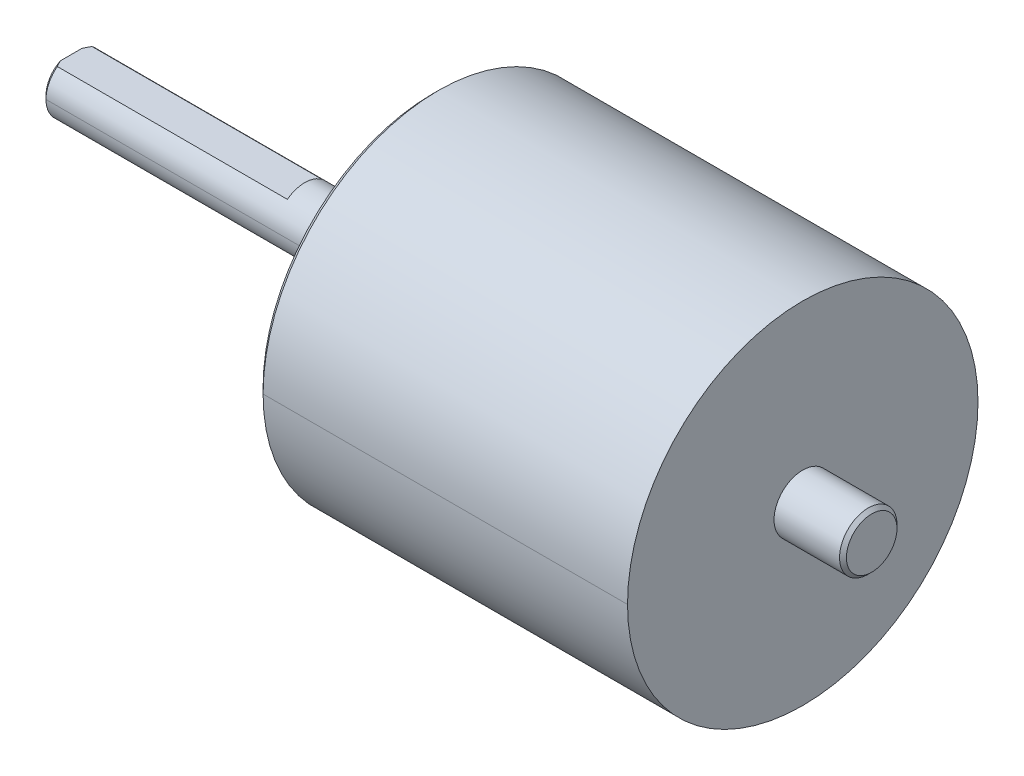
ISO-10303-21;
HEADER;
FILE_DESCRIPTION(('STEP AP214'),'2;1');
FILE_NAME('part.step','',(''),(''),'','','');
FILE_SCHEMA(('AUTOMOTIVE_DESIGN { 1 0 10303 214 1 1 1 1 }'));
ENDSEC;
DATA;
#1=APPLICATION_CONTEXT('core data for automotive mechanical design processes');
#2=APPLICATION_PROTOCOL_DEFINITION('international standard','automotive_design',2000,#1);
#3=PRODUCT_CONTEXT('',#1,'mechanical');
#4=PRODUCT('Part','Part','',(#3));
#5=PRODUCT_RELATED_PRODUCT_CATEGORY('part','',(#4));
#6=PRODUCT_DEFINITION_FORMATION('','',#4);
#7=PRODUCT_DEFINITION_CONTEXT('part definition',#1,'design');
#8=PRODUCT_DEFINITION('design','',#6,#7);
#9=PRODUCT_DEFINITION_SHAPE('','',#8);
#10=(LENGTH_UNIT() NAMED_UNIT(*) SI_UNIT(.MILLI.,.METRE.));
#11=(NAMED_UNIT(*) PLANE_ANGLE_UNIT() SI_UNIT($,.RADIAN.));
#12=(NAMED_UNIT(*) SI_UNIT($,.STERADIAN.) SOLID_ANGLE_UNIT());
#13=UNCERTAINTY_MEASURE_WITH_UNIT(LENGTH_MEASURE(1.E-05),#10,'distance_accuracy_value','');
#14=(GEOMETRIC_REPRESENTATION_CONTEXT(3) GLOBAL_UNCERTAINTY_ASSIGNED_CONTEXT((#13)) GLOBAL_UNIT_ASSIGNED_CONTEXT((#10,
#11,#12)) REPRESENTATION_CONTEXT('',''));
#15=CARTESIAN_POINT('',(0.,0.,0.));
#16=DIRECTION('',(0.,0.,1.));
#17=DIRECTION('',(1.,0.,0.));
#18=AXIS2_PLACEMENT_3D('',#15,#16,#17);
#19=CARTESIAN_POINT('',(-11.1252,1.98755,2.49555));
#20=DIRECTION('',(0.,1.,0.));
#21=DIRECTION('',(0.,0.,1.));
#22=AXIS2_PLACEMENT_3D('',#19,#20,#21);
#23=PLANE('',#22);
#24=CARTESIAN_POINT('',(-31.4452,1.98755,0.932783361772756));
#25=CARTESIAN_POINT('',(-31.3600033930898,1.98755,1.13331589479993));
#26=CARTESIAN_POINT('',(-31.2572320918835,1.98755,1.32384804296652));
#27=CARTESIAN_POINT('',(-31.1451999999999,1.98755,1.50911059899532));
#28=B_SPLINE_CURVE_WITH_KNOTS('',3,(#24,#25,#26,#27),.UNSPECIFIED.,.F.,.F.,(4,4),
(0.00727967764469756,0.0079358726159729),.UNSPECIFIED.);
#29=CARTESIAN_POINT('',(-31.4452,1.98755,0.932783361772695));
#30=VERTEX_POINT('',#29);
#31=CARTESIAN_POINT('',(-31.1451999999999,1.98755,1.50911059899532));
#32=VERTEX_POINT('',#31);
#33=EDGE_CURVE('E119',#30,#32,#28,.T.);
#34=ORIENTED_EDGE('',*,*,#33,.T.);
#35=DIRECTION('',(1.,0.,0.));
#36=VECTOR('',#35,1.);
#37=CARTESIAN_POINT('',(44.13504,1.98755,1.50911059899532));
#38=LINE('',#37,#36);
#39=CARTESIAN_POINT('',(-11.1252,1.98755,1.50911059899532));
#40=VERTEX_POINT('',#39);
#41=EDGE_CURVE('E123',#32,#40,#38,.T.);
#42=ORIENTED_EDGE('',*,*,#41,.T.);
#43=DIRECTION('',(0.,0.,-1.));
#44=VECTOR('',#43,1.);
#45=CARTESIAN_POINT('',(-11.1252,1.98755,2.49555));
#46=LINE('',#45,#44);
#47=CARTESIAN_POINT('',(-11.1252,1.98755,-1.50911059899532));
#48=VERTEX_POINT('',#47);
#49=EDGE_CURVE('E146',#40,#48,#46,.T.);
#50=ORIENTED_EDGE('',*,*,#49,.T.);
#51=DIRECTION('',(1.,0.,0.));
#52=VECTOR('',#51,1.);
#53=CARTESIAN_POINT('',(44.13504,1.98755,-1.50911059899532));
#54=LINE('',#53,#52);
#55=CARTESIAN_POINT('',(-31.1451999999999,1.98755,-1.50911059899532));
#56=VERTEX_POINT('',#55);
#57=EDGE_CURVE('E157',#56,#48,#54,.T.);
#58=ORIENTED_EDGE('',*,*,#57,.F.);
#59=CARTESIAN_POINT('',(-31.1451999999999,1.98755,-1.50911059899532));
#60=CARTESIAN_POINT('',(-31.2576842597599,1.98755,-1.32310031278401));
#61=CARTESIAN_POINT('',(-31.3604226766004,1.98755,-1.13232900121902));
#62=CARTESIAN_POINT('',(-31.4452,1.98755,-0.932783361772695));
#63=B_SPLINE_CURVE_WITH_KNOTS('',3,(#59,#60,#61,#62),.UNSPECIFIED.,.F.,.F.,(4,4),
(0.00470476113088296,0.00535512984343857),.UNSPECIFIED.);
#64=CARTESIAN_POINT('',(-31.4452,1.98755,-0.932783361772695));
#65=VERTEX_POINT('',#64);
#66=EDGE_CURVE('E148',#56,#65,#63,.T.);
#67=ORIENTED_EDGE('',*,*,#66,.T.);
#68=DIRECTION('',(0.,0.,-1.));
#69=VECTOR('',#68,1.);
#70=CARTESIAN_POINT('',(-31.4452,1.98755,2.49555));
#71=LINE('',#70,#69);
#72=EDGE_CURVE('E126',#30,#65,#71,.T.);
#73=ORIENTED_EDGE('',*,*,#72,.F.);
#74=EDGE_LOOP('',(#34,#42,#50,#58,#67,#73));
#75=FACE_BOUND('',#74,.T.);
#76=ADVANCED_FACE('F34',(#75),#23,.T.);
#77=CARTESIAN_POINT('',(-31.4452,1.1431733546534,0.));
#78=DIRECTION('',(1.,0.,0.));
#79=DIRECTION('',(0.,0.,-1.));
#80=AXIS2_PLACEMENT_3D('',#77,#78,#79);
#81=PLANE('',#80);
#82=ORIENTED_EDGE('',*,*,#72,.T.);
#83=CARTESIAN_POINT('',(-31.4452,0.,0.));
#84=DIRECTION('',(1.,0.,0.));
#85=DIRECTION('',(0.,0.,-1.));
#86=AXIS2_PLACEMENT_3D('',#83,#84,#85);
#87=CIRCLE('',#86,2.19555);
#88=CARTESIAN_POINT('',(-31.4452,0.,-2.19555));
#89=VERTEX_POINT('',#88);
#90=EDGE_CURVE('E774',#89,#65,#87,.T.);
#91=ORIENTED_EDGE('',*,*,#90,.F.);
#92=CARTESIAN_POINT('',(-31.4452,0.,0.));
#93=DIRECTION('',(1.,0.,0.));
#94=DIRECTION('',(0.,0.,-1.));
#95=AXIS2_PLACEMENT_3D('',#92,#93,#94);
#96=CIRCLE('',#95,2.19555);
#97=EDGE_CURVE('E770',#30,#89,#96,.T.);
#98=ORIENTED_EDGE('',*,*,#97,.F.);
#99=EDGE_LOOP('',(#82,#91,#98));
#100=FACE_BOUND('',#99,.T.);
#101=CARTESIAN_POINT('',(-31.4452,0.,0.));
#102=DIRECTION('',(1.,0.,0.));
#103=DIRECTION('',(0.,0.,-1.));
#104=AXIS2_PLACEMENT_3D('',#101,#102,#103);
#105=CIRCLE('',#104,1.1431733546534);
#106=CARTESIAN_POINT('',(-31.4452,0.,-1.1431733546534));
#107=VERTEX_POINT('',#106);
#108=CARTESIAN_POINT('',(-31.4452,0.,1.14317335465341));
#109=VERTEX_POINT('',#108);
#110=EDGE_CURVE('E781',#107,#109,#105,.T.);
#111=ORIENTED_EDGE('',*,*,#110,.T.);
#112=CARTESIAN_POINT('',(-31.4452,0.,0.));
#113=DIRECTION('',(1.,0.,0.));
#114=DIRECTION('',(0.,0.,-1.));
#115=AXIS2_PLACEMENT_3D('',#112,#113,#114);
#116=CIRCLE('',#115,1.1431733546534);
#117=EDGE_CURVE('E783',#109,#107,#116,.T.);
#118=ORIENTED_EDGE('',*,*,#117,.T.);
#119=EDGE_LOOP('',(#111,#118));
#120=FACE_BOUND('',#119,.T.);
#121=ADVANCED_FACE('F177',(#100,#120),#81,.F.);
#122=CARTESIAN_POINT('',(-30.4992,0.,0.));
#123=DIRECTION('',(-1.,0.,0.));
#124=DIRECTION('',(0.,1.,0.));
#125=AXIS2_PLACEMENT_3D('',#122,#123,#124);
#126=CONICAL_SURFACE('',#125,0.597,0.523598775598315);
#127=ORIENTED_EDGE('',*,*,#117,.F.);
#128=CARTESIAN_POINT('',(-30.4992,0.,0.597));
#129=DIRECTION('',(-0.86602540378443,0.,0.500000000000015));
#130=VECTOR('',#129,1.);
#131=LINE('',#128,#130);
#132=CARTESIAN_POINT('',(-30.4992,0.,0.597));
#133=VERTEX_POINT('',#132);
#134=EDGE_CURVE('E222',#133,#109,#131,.T.);
#135=ORIENTED_EDGE('',*,*,#134,.F.);
#136=CARTESIAN_POINT('',(-30.4992,0.,0.));
#137=DIRECTION('',(1.,0.,0.));
#138=DIRECTION('',(0.,0.,-1.));
#139=AXIS2_PLACEMENT_3D('',#136,#137,#138);
#140=CIRCLE('',#139,0.597);
#141=CARTESIAN_POINT('',(-30.4992,0.,-0.597));
#142=VERTEX_POINT('',#141);
#143=EDGE_CURVE('E786',#133,#142,#140,.T.);
#144=ORIENTED_EDGE('',*,*,#143,.T.);
#145=CARTESIAN_POINT('',(-30.4992,0.,-0.597));
#146=DIRECTION('',(-0.86602540378443,0.,-0.500000000000015));
#147=VECTOR('',#146,1.);
#148=LINE('',#145,#147);
#149=EDGE_CURVE('E223',#142,#107,#148,.T.);
#150=ORIENTED_EDGE('',*,*,#149,.T.);
#151=EDGE_LOOP('',(#127,#135,#144,#150));
#152=FACE_BOUND('',#151,.T.);
#153=ADVANCED_FACE('F190',(#152),#126,.F.);
#154=CARTESIAN_POINT('',(-30.4992,0.,0.));
#155=DIRECTION('',(-1.,0.,0.));
#156=DIRECTION('',(0.,-1.,0.));
#157=AXIS2_PLACEMENT_3D('',#154,#155,#156);
#158=CONICAL_SURFACE('',#157,0.597,0.523598775598315);
#159=CARTESIAN_POINT('',(-30.4992,0.,0.));
#160=DIRECTION('',(1.,0.,0.));
#161=DIRECTION('',(0.,0.,-1.));
#162=AXIS2_PLACEMENT_3D('',#159,#160,#161);
#163=CIRCLE('',#162,0.597);
#164=EDGE_CURVE('E219',#142,#133,#163,.T.);
#165=ORIENTED_EDGE('',*,*,#164,.T.);
#166=ORIENTED_EDGE('',*,*,#134,.T.);
#167=ORIENTED_EDGE('',*,*,#110,.F.);
#168=ORIENTED_EDGE('',*,*,#149,.F.);
#169=EDGE_LOOP('',(#165,#166,#167,#168));
#170=FACE_BOUND('',#169,.T.);
#171=ADVANCED_FACE('F195',(#170),#158,.F.);
#172=CARTESIAN_POINT('',(44.13504,0.,0.));
#173=DIRECTION('',(-1.,0.,0.));
#174=DIRECTION('',(0.,-1.,0.));
#175=AXIS2_PLACEMENT_3D('',#172,#173,#174);
#176=CYLINDRICAL_SURFACE('',#175,0.597);
#177=CARTESIAN_POINT('',(-29.3051999999999,0.,0.));
#178=DIRECTION('',(1.,0.,0.));
#179=DIRECTION('',(0.,0.,-1.));
#180=AXIS2_PLACEMENT_3D('',#177,#178,#179);
#181=CIRCLE('',#180,0.597);
#182=CARTESIAN_POINT('',(-29.3051999999999,0.,-0.597));
#183=VERTEX_POINT('',#182);
#184=CARTESIAN_POINT('',(-29.3052000000038,0.,0.596999999997706));
#185=VERTEX_POINT('',#184);
#186=EDGE_CURVE('E249',#183,#185,#181,.T.);
#187=ORIENTED_EDGE('',*,*,#186,.T.);
#188=CARTESIAN_POINT('',(-29.3051999999999,0.,0.597));
#189=DIRECTION('',(-1.,0.,0.));
#190=VECTOR('',#189,1.);
#191=LINE('',#188,#190);
#192=EDGE_CURVE('E251',#185,#133,#191,.T.);
#193=ORIENTED_EDGE('',*,*,#192,.T.);
#194=ORIENTED_EDGE('',*,*,#164,.F.);
#195=CARTESIAN_POINT('',(-29.3051999999999,0.,-0.597));
#196=DIRECTION('',(-1.,0.,0.));
#197=VECTOR('',#196,1.);
#198=LINE('',#195,#197);
#199=EDGE_CURVE('E298',#183,#142,#198,.T.);
#200=ORIENTED_EDGE('',*,*,#199,.F.);
#201=EDGE_LOOP('',(#187,#193,#194,#200));
#202=FACE_BOUND('',#201,.T.);
#203=ADVANCED_FACE('F261',(#202),#176,.F.);
#204=CARTESIAN_POINT('',(44.13504,0.,0.));
#205=DIRECTION('',(-1.,0.,0.));
#206=DIRECTION('',(0.,1.,0.));
#207=AXIS2_PLACEMENT_3D('',#204,#205,#206);
#208=CYLINDRICAL_SURFACE('',#207,0.597);
#209=ORIENTED_EDGE('',*,*,#143,.F.);
#210=ORIENTED_EDGE('',*,*,#192,.F.);
#211=CARTESIAN_POINT('',(-29.3051999999999,0.,0.));
#212=DIRECTION('',(1.,0.,0.));
#213=DIRECTION('',(0.,0.,-1.));
#214=AXIS2_PLACEMENT_3D('',#211,#212,#213);
#215=CIRCLE('',#214,0.597);
#216=EDGE_CURVE('E296',#185,#183,#215,.T.);
#217=ORIENTED_EDGE('',*,*,#216,.T.);
#218=ORIENTED_EDGE('',*,*,#199,.T.);
#219=EDGE_LOOP('',(#209,#210,#217,#218));
#220=FACE_BOUND('',#219,.T.);
#221=ADVANCED_FACE('F270',(#220),#208,.F.);
#222=CARTESIAN_POINT('',(-528.96052188907,0.,0.));
#223=DIRECTION('',(-1.,0.,0.));
#224=DIRECTION('',(0.,1.,0.));
#225=AXIS2_PLACEMENT_3D('',#222,#223,#224);
#226=CONICAL_SURFACE('',#225,866.025403784567,1.04719755119686);
#227=CARTESIAN_POINT('',(-28.9605218892991,0.,1.11022302462516E-13));
#228=DIRECTION('',(-0.499999999999732,0.,-0.866025403784593));
#229=VECTOR('',#228,1.);
#230=LINE('',#227,#229);
#231=CARTESIAN_POINT('',(-28.960521889294,0.,0.));
#232=VERTEX_POINT('',#231);
#233=EDGE_CURVE('E313',#232,#183,#230,.T.);
#234=ORIENTED_EDGE('',*,*,#233,.T.);
#235=ORIENTED_EDGE('',*,*,#216,.F.);
#236=CARTESIAN_POINT('',(-28.9605218892991,0.,-1.11022302462516E-13));
#237=DIRECTION('',(-0.499999999999732,0.,0.866025403784593));
#238=VECTOR('',#237,1.);
#239=LINE('',#236,#238);
#240=EDGE_CURVE('E343',#232,#185,#239,.T.);
#241=ORIENTED_EDGE('',*,*,#240,.F.);
#242=EDGE_LOOP('',(#234,#235,#241));
#243=FACE_BOUND('',#242,.T.);
#244=ADVANCED_FACE('F319',(#243),#226,.F.);
#245=CARTESIAN_POINT('',(-528.96052188907,0.,0.));
#246=DIRECTION('',(-1.,0.,0.));
#247=DIRECTION('',(0.,-1.,0.));
#248=AXIS2_PLACEMENT_3D('',#245,#246,#247);
#249=CONICAL_SURFACE('',#248,866.025403784567,1.04719755119686);
#250=ORIENTED_EDGE('',*,*,#240,.T.);
#251=ORIENTED_EDGE('',*,*,#186,.F.);
#252=ORIENTED_EDGE('',*,*,#233,.F.);
#253=EDGE_LOOP('',(#250,#251,#252));
#254=FACE_BOUND('',#253,.T.);
#255=ADVANCED_FACE('F328',(#254),#249,.F.);
#256=CARTESIAN_POINT('',(-31.4452,0.,0.));
#257=DIRECTION('',(1.,0.,0.));
#258=DIRECTION('',(0.,0.,-1.));
#259=AXIS2_PLACEMENT_3D('',#256,#257,#258);
#260=CONICAL_SURFACE('',#259,2.19555,0.785398163397457);
#261=CARTESIAN_POINT('',(-31.1451999999999,0.,0.));
#262=DIRECTION('',(1.,0.,0.));
#263=DIRECTION('',(0.,0.,-1.));
#264=AXIS2_PLACEMENT_3D('',#261,#262,#263);
#265=CIRCLE('',#264,2.49555);
#266=CARTESIAN_POINT('',(-31.1451999999999,0.,2.49555));
#267=VERTEX_POINT('',#266);
#268=CARTESIAN_POINT('',(-31.1451999999999,0.,-2.49555));
#269=VERTEX_POINT('',#268);
#270=EDGE_CURVE('E137',#267,#269,#265,.T.);
#271=ORIENTED_EDGE('',*,*,#270,.F.);
#272=CARTESIAN_POINT('',(-31.1451999999999,0.,0.));
#273=DIRECTION('',(1.,0.,0.));
#274=DIRECTION('',(0.,0.,-1.));
#275=AXIS2_PLACEMENT_3D('',#272,#273,#274);
#276=CIRCLE('',#275,2.49555);
#277=EDGE_CURVE('E134',#32,#267,#276,.T.);
#278=ORIENTED_EDGE('',*,*,#277,.F.);
#279=ORIENTED_EDGE('',*,*,#33,.F.);
#280=ORIENTED_EDGE('',*,*,#97,.T.);
#281=DIRECTION('',(0.707106781186541,0.,-0.707106781186554));
#282=VECTOR('',#281,1.);
#283=CARTESIAN_POINT('',(-31.4452,0.,-2.19555));
#284=LINE('',#283,#282);
#285=EDGE_CURVE('E771',#89,#269,#284,.T.);
#286=ORIENTED_EDGE('',*,*,#285,.T.);
#287=EDGE_LOOP('',(#271,#278,#279,#280,#286));
#288=FACE_BOUND('',#287,.T.);
#289=ADVANCED_FACE('F135',(#288),#260,.T.);
#290=CARTESIAN_POINT('',(-31.4452,0.,0.));
#291=DIRECTION('',(1.,0.,0.));
#292=DIRECTION('',(0.,0.,-1.));
#293=AXIS2_PLACEMENT_3D('',#290,#291,#292);
#294=CONICAL_SURFACE('',#293,2.19555,0.785398163397457);
#295=ORIENTED_EDGE('',*,*,#66,.F.);
#296=CARTESIAN_POINT('',(-31.1451999999999,0.,0.));
#297=DIRECTION('',(1.,0.,0.));
#298=DIRECTION('',(0.,0.,-1.));
#299=AXIS2_PLACEMENT_3D('',#296,#297,#298);
#300=CIRCLE('',#299,2.49555);
#301=EDGE_CURVE('E159',#269,#56,#300,.T.);
#302=ORIENTED_EDGE('',*,*,#301,.F.);
#303=ORIENTED_EDGE('',*,*,#285,.F.);
#304=ORIENTED_EDGE('',*,*,#90,.T.);
#305=EDGE_LOOP('',(#295,#302,#303,#304));
#306=FACE_BOUND('',#305,.T.);
#307=ADVANCED_FACE('F380',(#306),#294,.T.);
#308=CARTESIAN_POINT('',(44.13504,0.,0.));
#309=DIRECTION('',(-1.,0.,0.));
#310=DIRECTION('',(0.,-1.,0.));
#311=AXIS2_PLACEMENT_3D('',#308,#309,#310);
#312=CYLINDRICAL_SURFACE('',#311,2.49555);
#313=CARTESIAN_POINT('',(0.,0.,0.));
#314=DIRECTION('',(1.,0.,0.));
#315=DIRECTION('',(0.,0.,-1.));
#316=AXIS2_PLACEMENT_3D('',#313,#314,#315);
#317=CIRCLE('',#316,2.49555);
#318=CARTESIAN_POINT('',(0.,0.,-2.49555));
#319=VERTEX_POINT('',#318);
#320=CARTESIAN_POINT('',(0.,0.,2.49555));
#321=VERTEX_POINT('',#320);
#322=EDGE_CURVE('E404',#319,#321,#317,.T.);
#323=ORIENTED_EDGE('',*,*,#322,.F.);
#324=CARTESIAN_POINT('',(0.,0.,-2.49555));
#325=DIRECTION('',(-1.,0.,0.));
#326=VECTOR('',#325,1.);
#327=LINE('',#324,#326);
#328=EDGE_CURVE('E401',#319,#269,#327,.T.);
#329=ORIENTED_EDGE('',*,*,#328,.T.);
#330=ORIENTED_EDGE('',*,*,#301,.T.);
#331=ORIENTED_EDGE('',*,*,#57,.T.);
#332=CARTESIAN_POINT('',(-11.1252,0.,0.));
#333=DIRECTION('',(1.,0.,0.));
#334=DIRECTION('',(0.,0.,-1.));
#335=AXIS2_PLACEMENT_3D('',#332,#333,#334);
#336=CIRCLE('',#335,2.49555);
#337=EDGE_CURVE('E140',#48,#40,#336,.T.);
#338=ORIENTED_EDGE('',*,*,#337,.T.);
#339=ORIENTED_EDGE('',*,*,#41,.F.);
#340=ORIENTED_EDGE('',*,*,#277,.T.);
#341=CARTESIAN_POINT('',(0.,0.,2.49555));
#342=DIRECTION('',(-1.,0.,0.));
#343=VECTOR('',#342,1.);
#344=LINE('',#341,#343);
#345=EDGE_CURVE('E364',#321,#267,#344,.T.);
#346=ORIENTED_EDGE('',*,*,#345,.F.);
#347=EDGE_LOOP('',(#323,#329,#330,#331,#338,#339,#340,#346));
#348=FACE_BOUND('',#347,.T.);
#349=ADVANCED_FACE('F142',(#348),#312,.T.);
#350=CARTESIAN_POINT('',(44.13504,0.,0.));
#351=DIRECTION('',(-1.,0.,0.));
#352=DIRECTION('',(0.,1.,0.));
#353=AXIS2_PLACEMENT_3D('',#350,#351,#352);
#354=CYLINDRICAL_SURFACE('',#353,2.49555);
#355=ORIENTED_EDGE('',*,*,#270,.T.);
#356=ORIENTED_EDGE('',*,*,#328,.F.);
#357=CARTESIAN_POINT('',(0.,0.,0.));
#358=DIRECTION('',(1.,0.,0.));
#359=DIRECTION('',(0.,0.,-1.));
#360=AXIS2_PLACEMENT_3D('',#357,#358,#359);
#361=CIRCLE('',#360,2.49555);
#362=EDGE_CURVE('E407',#321,#319,#361,.T.);
#363=ORIENTED_EDGE('',*,*,#362,.F.);
#364=ORIENTED_EDGE('',*,*,#345,.T.);
#365=EDGE_LOOP('',(#355,#356,#363,#364));
#366=FACE_BOUND('',#365,.T.);
#367=ADVANCED_FACE('F440',(#366),#354,.T.);
#368=CARTESIAN_POINT('',(0.,2.49555,0.));
#369=DIRECTION('',(1.,0.,0.));
#370=DIRECTION('',(0.,0.,-1.));
#371=AXIS2_PLACEMENT_3D('',#368,#369,#370);
#372=PLANE('',#371);
#373=CARTESIAN_POINT('',(0.,0.,0.));
#374=DIRECTION('',(1.,0.,0.));
#375=DIRECTION('',(0.,0.,-1.));
#376=AXIS2_PLACEMENT_3D('',#373,#374,#375);
#377=CIRCLE('',#376,14.75);
#378=CARTESIAN_POINT('',(0.,0.,-14.75));
#379=VERTEX_POINT('',#378);
#380=CARTESIAN_POINT('',(0.,0.,14.75));
#381=VERTEX_POINT('',#380);
#382=EDGE_CURVE('E464',#379,#381,#377,.T.);
#383=ORIENTED_EDGE('',*,*,#382,.F.);
#384=CARTESIAN_POINT('',(0.,0.,0.));
#385=DIRECTION('',(1.,0.,0.));
#386=DIRECTION('',(0.,0.,-1.));
#387=AXIS2_PLACEMENT_3D('',#384,#385,#386);
#388=CIRCLE('',#387,14.75);
#389=EDGE_CURVE('E471',#381,#379,#388,.T.);
#390=ORIENTED_EDGE('',*,*,#389,.F.);
#391=EDGE_LOOP('',(#383,#390));
#392=FACE_BOUND('',#391,.T.);
#393=ORIENTED_EDGE('',*,*,#322,.T.);
#394=ORIENTED_EDGE('',*,*,#362,.T.);
#395=EDGE_LOOP('',(#393,#394));
#396=FACE_BOUND('',#395,.T.);
#397=ADVANCED_FACE('F449',(#392,#396),#372,.F.);
#398=CARTESIAN_POINT('',(0.,0.,0.));
#399=DIRECTION('',(1.,0.,0.));
#400=DIRECTION('',(0.,1.,0.));
#401=AXIS2_PLACEMENT_3D('',#398,#399,#400);
#402=CONICAL_SURFACE('',#401,14.75,0.785398163397448);
#403=ORIENTED_EDGE('',*,*,#389,.T.);
#404=CARTESIAN_POINT('',(0.,0.,-14.75));
#405=DIRECTION('',(0.707106781186547,0.,-0.707106781186548));
#406=VECTOR('',#405,1.);
#407=LINE('',#404,#406);
#408=CARTESIAN_POINT('',(0.500000000000001,0.,-15.25));
#409=VERTEX_POINT('',#408);
#410=EDGE_CURVE('E468',#379,#409,#407,.T.);
#411=ORIENTED_EDGE('',*,*,#410,.T.);
#412=CARTESIAN_POINT('',(0.500000000000001,0.,0.));
#413=DIRECTION('',(1.,0.,0.));
#414=DIRECTION('',(0.,0.,-1.));
#415=AXIS2_PLACEMENT_3D('',#412,#413,#414);
#416=CIRCLE('',#415,15.25);
#417=CARTESIAN_POINT('',(0.5,0.,15.25));
#418=VERTEX_POINT('',#417);
#419=EDGE_CURVE('E579',#418,#409,#416,.T.);
#420=ORIENTED_EDGE('',*,*,#419,.F.);
#421=CARTESIAN_POINT('',(0.,0.,14.75));
#422=DIRECTION('',(0.707106781186547,0.,0.707106781186548));
#423=VECTOR('',#422,1.);
#424=LINE('',#421,#423);
#425=EDGE_CURVE('E467',#381,#418,#424,.T.);
#426=ORIENTED_EDGE('',*,*,#425,.F.);
#427=EDGE_LOOP('',(#403,#411,#420,#426));
#428=FACE_BOUND('',#427,.T.);
#429=ADVANCED_FACE('F485',(#428),#402,.T.);
#430=CARTESIAN_POINT('',(0.,0.,0.));
#431=DIRECTION('',(1.,0.,0.));
#432=DIRECTION('',(0.,-1.,0.));
#433=AXIS2_PLACEMENT_3D('',#430,#431,#432);
#434=CONICAL_SURFACE('',#433,14.75,0.785398163397448);
#435=CARTESIAN_POINT('',(0.500000000000001,0.,0.));
#436=DIRECTION('',(1.,0.,0.));
#437=DIRECTION('',(0.,0.,-1.));
#438=AXIS2_PLACEMENT_3D('',#435,#436,#437);
#439=CIRCLE('',#438,15.25);
#440=EDGE_CURVE('E511',#409,#418,#439,.T.);
#441=ORIENTED_EDGE('',*,*,#440,.F.);
#442=ORIENTED_EDGE('',*,*,#410,.F.);
#443=ORIENTED_EDGE('',*,*,#382,.T.);
#444=ORIENTED_EDGE('',*,*,#425,.T.);
#445=EDGE_LOOP('',(#441,#442,#443,#444));
#446=FACE_BOUND('',#445,.T.);
#447=ADVANCED_FACE('F494',(#446),#434,.T.);
#448=CARTESIAN_POINT('',(44.13504,0.,0.));
#449=DIRECTION('',(-1.,0.,0.));
#450=DIRECTION('',(0.,-1.,0.));
#451=AXIS2_PLACEMENT_3D('',#448,#449,#450);
#452=CYLINDRICAL_SURFACE('',#451,15.25);
#453=CARTESIAN_POINT('',(32.2148,0.,0.));
#454=DIRECTION('',(-1.,0.,0.));
#455=DIRECTION('',(0.,-1.,0.));
#456=AXIS2_PLACEMENT_3D('',#453,#454,#455);
#457=CIRCLE('',#456,15.25);
#458=CARTESIAN_POINT('',(32.2148,0.,-15.25));
#459=VERTEX_POINT('',#458);
#460=CARTESIAN_POINT('',(32.2148,0.,15.25));
#461=VERTEX_POINT('',#460);
#462=EDGE_CURVE('E51',#459,#461,#457,.F.);
#463=ORIENTED_EDGE('',*,*,#462,.F.);
#464=CARTESIAN_POINT('',(32.2148,0.,-15.25));
#465=DIRECTION('',(-1.,0.,0.));
#466=VECTOR('',#465,1.);
#467=LINE('',#464,#466);
#468=EDGE_CURVE('E515',#459,#409,#467,.T.);
#469=ORIENTED_EDGE('',*,*,#468,.T.);
#470=ORIENTED_EDGE('',*,*,#440,.T.);
#471=CARTESIAN_POINT('',(32.2148,0.,15.25));
#472=DIRECTION('',(-1.,0.,0.));
#473=VECTOR('',#472,1.);
#474=LINE('',#471,#473);
#475=EDGE_CURVE('E514',#461,#418,#474,.T.);
#476=ORIENTED_EDGE('',*,*,#475,.F.);
#477=EDGE_LOOP('',(#463,#469,#470,#476));
#478=FACE_BOUND('',#477,.T.);
#479=ADVANCED_FACE('F542',(#478),#452,.T.);
#480=CARTESIAN_POINT('',(44.13504,0.,0.));
#481=DIRECTION('',(-1.,0.,0.));
#482=DIRECTION('',(0.,1.,0.));
#483=AXIS2_PLACEMENT_3D('',#480,#481,#482);
#484=CYLINDRICAL_SURFACE('',#483,15.25);
#485=CARTESIAN_POINT('',(32.2148,0.,0.));
#486=DIRECTION('',(-1.,0.,0.));
#487=DIRECTION('',(0.,-1.,0.));
#488=AXIS2_PLACEMENT_3D('',#485,#486,#487);
#489=CIRCLE('',#488,15.25);
#490=EDGE_CURVE('E48',#461,#459,#489,.F.);
#491=ORIENTED_EDGE('',*,*,#490,.F.);
#492=ORIENTED_EDGE('',*,*,#475,.T.);
#493=ORIENTED_EDGE('',*,*,#419,.T.);
#494=ORIENTED_EDGE('',*,*,#468,.F.);
#495=EDGE_LOOP('',(#491,#492,#493,#494));
#496=FACE_BOUND('',#495,.T.);
#497=ADVANCED_FACE('F551',(#496),#484,.T.);
#498=CARTESIAN_POINT('',(-11.1252,0.,0.));
#499=DIRECTION('',(1.,0.,0.));
#500=DIRECTION('',(0.,0.,-1.));
#501=AXIS2_PLACEMENT_3D('',#498,#499,#500);
#502=PLANE('',#501);
#503=ORIENTED_EDGE('',*,*,#49,.F.);
#504=ORIENTED_EDGE('',*,*,#337,.F.);
#505=EDGE_LOOP('',(#503,#504));
#506=FACE_BOUND('',#505,.T.);
#507=ADVANCED_FACE('F557',(#506),#502,.F.);
#508=CARTESIAN_POINT('',(32.2148,15.25,-15.25005));
#509=DIRECTION('',(-1.,0.,0.));
#510=DIRECTION('',(0.,-1.,0.));
#511=AXIS2_PLACEMENT_3D('',#508,#509,#510);
#512=PLANE('',#511);
#513=CARTESIAN_POINT('',(32.2148,0.,0.));
#514=DIRECTION('',(1.,0.,0.));
#515=DIRECTION('',(0.,1.,0.));
#516=AXIS2_PLACEMENT_3D('',#513,#514,#515);
#517=CIRCLE('',#516,2.5);
#518=CARTESIAN_POINT('',(32.2148,2.50000000000001,0.));
#519=VERTEX_POINT('',#518);
#520=EDGE_CURVE('E580',#519,#519,#517,.T.);
#521=ORIENTED_EDGE('',*,*,#520,.F.);
#522=EDGE_LOOP('',(#521));
#523=FACE_BOUND('',#522,.T.);
#524=ORIENTED_EDGE('',*,*,#462,.T.);
#525=ORIENTED_EDGE('',*,*,#490,.T.);
#526=EDGE_LOOP('',(#524,#525));
#527=FACE_BOUND('',#526,.T.);
#528=ADVANCED_FACE('F615',(#523,#527),#512,.F.);
#529=CARTESIAN_POINT('',(38.2148,0.,0.));
#530=DIRECTION('',(-1.,0.,0.));
#531=DIRECTION('',(0.,-1.,0.));
#532=AXIS2_PLACEMENT_3D('',#529,#530,#531);
#533=CYLINDRICAL_SURFACE('',#532,2.5);
#534=CARTESIAN_POINT('',(37.9148,0.,0.));
#535=DIRECTION('',(1.,0.,0.));
#536=DIRECTION('',(0.,1.,0.));
#537=AXIS2_PLACEMENT_3D('',#534,#535,#536);
#538=CIRCLE('',#537,2.5);
#539=CARTESIAN_POINT('',(37.9148,2.50000000000001,0.));
#540=VERTEX_POINT('',#539);
#541=EDGE_CURVE('E11',#540,#540,#538,.F.);
#542=ORIENTED_EDGE('',*,*,#541,.T.);
#543=EDGE_LOOP('',(#542));
#544=FACE_BOUND('',#543,.T.);
#545=ORIENTED_EDGE('',*,*,#520,.T.);
#546=EDGE_LOOP('',(#545));
#547=FACE_BOUND('',#546,.T.);
#548=ADVANCED_FACE('F178',(#544,#547),#533,.T.);
#549=CARTESIAN_POINT('',(38.2148,0.,0.));
#550=DIRECTION('',(1.,0.,0.));
#551=DIRECTION('',(0.,1.,0.));
#552=AXIS2_PLACEMENT_3D('',#549,#550,#551);
#553=PLANE('',#552);
#554=CARTESIAN_POINT('',(38.2148,0.,0.));
#555=DIRECTION('',(1.,0.,0.));
#556=DIRECTION('',(0.,1.,0.));
#557=AXIS2_PLACEMENT_3D('',#554,#555,#556);
#558=CIRCLE('',#557,2.19999999999999);
#559=CARTESIAN_POINT('',(38.2148,2.19999999999999,0.));
#560=VERTEX_POINT('',#559);
#561=EDGE_CURVE('E42',#560,#560,#558,.T.);
#562=ORIENTED_EDGE('',*,*,#561,.T.);
#563=EDGE_LOOP('',(#562));
#564=FACE_BOUND('',#563,.T.);
#565=ADVANCED_FACE('F630',(#564),#553,.T.);
#566=CARTESIAN_POINT('',(38.2148,0.,0.));
#567=DIRECTION('',(-1.,0.,0.));
#568=DIRECTION('',(0.,-1.,0.));
#569=AXIS2_PLACEMENT_3D('',#566,#567,#568);
#570=CONICAL_SURFACE('',#569,2.19999999999999,0.785398163397445);
#571=ORIENTED_EDGE('',*,*,#541,.F.);
#572=EDGE_LOOP('',(#571));
#573=FACE_BOUND('',#572,.T.);
#574=ORIENTED_EDGE('',*,*,#561,.F.);
#575=EDGE_LOOP('',(#574));
#576=FACE_BOUND('',#575,.T.);
#577=ADVANCED_FACE('F36',(#573,#576),#570,.T.);
#578=CLOSED_SHELL('',(#76,#121,#153,#171,#203,#221,#244,#255,#289,#307,#349,#367,#397,#429,#447,
#479,#497,#507,#528,#548,#565,#577));
#579=MANIFOLD_SOLID_BREP('B2',#578);
#580=ADVANCED_BREP_SHAPE_REPRESENTATION('',(#18,#579),#14);
#581=SHAPE_DEFINITION_REPRESENTATION(#9,#580);
ENDSEC;
END-ISO-10303-21;
